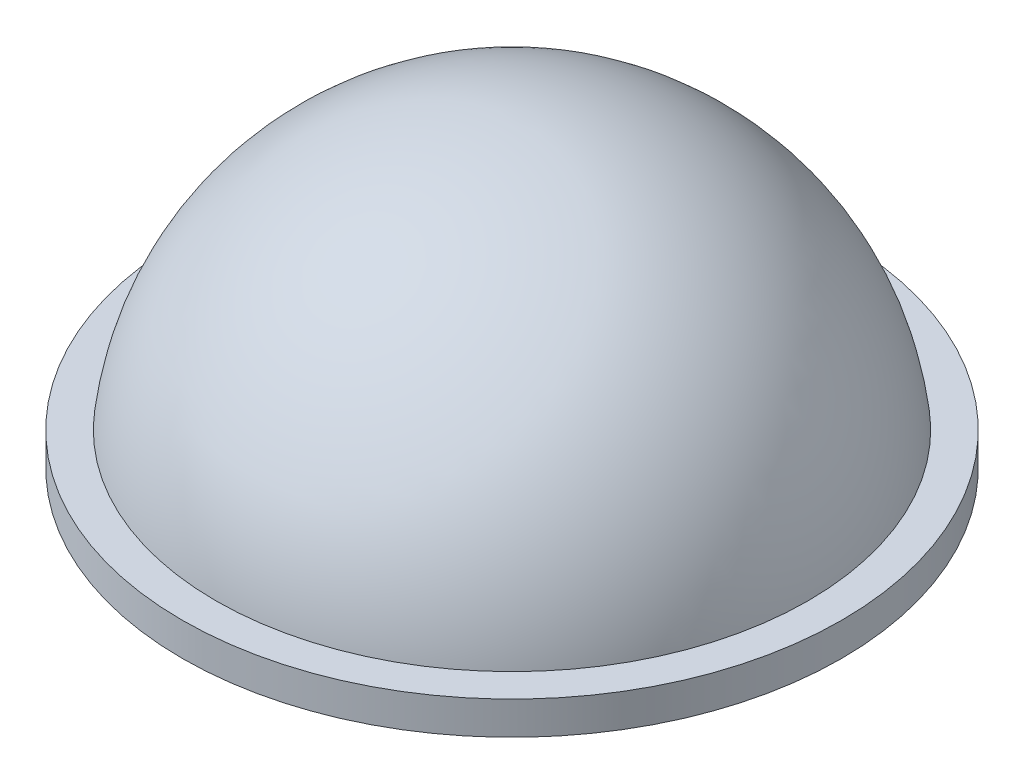
ISO-10303-21;
HEADER;
FILE_DESCRIPTION(('STEP AP214'),'2;1');
FILE_NAME('part.step','',(''),(''),'','','');
FILE_SCHEMA(('AUTOMOTIVE_DESIGN { 1 0 10303 214 1 1 1 1 }'));
ENDSEC;
DATA;
#1=APPLICATION_CONTEXT('core data for automotive mechanical design processes');
#2=APPLICATION_PROTOCOL_DEFINITION('international standard','automotive_design',2000,#1);
#3=PRODUCT_CONTEXT('',#1,'mechanical');
#4=PRODUCT('Part','Part','',(#3));
#5=PRODUCT_RELATED_PRODUCT_CATEGORY('part','',(#4));
#6=PRODUCT_DEFINITION_FORMATION('','',#4);
#7=PRODUCT_DEFINITION_CONTEXT('part definition',#1,'design');
#8=PRODUCT_DEFINITION('design','',#6,#7);
#9=PRODUCT_DEFINITION_SHAPE('','',#8);
#10=(LENGTH_UNIT() NAMED_UNIT(*) SI_UNIT(.MILLI.,.METRE.));
#11=(NAMED_UNIT(*) PLANE_ANGLE_UNIT() SI_UNIT($,.RADIAN.));
#12=(NAMED_UNIT(*) SI_UNIT($,.STERADIAN.) SOLID_ANGLE_UNIT());
#13=UNCERTAINTY_MEASURE_WITH_UNIT(LENGTH_MEASURE(1.E-05),#10,'distance_accuracy_value','');
#14=(GEOMETRIC_REPRESENTATION_CONTEXT(3) GLOBAL_UNCERTAINTY_ASSIGNED_CONTEXT((#13)) GLOBAL_UNIT_ASSIGNED_CONTEXT((#10,
#11,#12)) REPRESENTATION_CONTEXT('',''));
#15=CARTESIAN_POINT('',(0.,0.,0.));
#16=DIRECTION('',(0.,0.,1.));
#17=DIRECTION('',(1.,0.,0.));
#18=AXIS2_PLACEMENT_3D('',#15,#16,#17);
#19=CARTESIAN_POINT('',(0.,0.,0.));
#20=DIRECTION('',(0.,1.,0.));
#21=DIRECTION('',(1.,0.,0.));
#22=AXIS2_PLACEMENT_3D('',#19,#20,#21);
#23=SPHERICAL_SURFACE('',#22,45.);
#24=CARTESIAN_POINT('',(0.,5.,0.));
#25=DIRECTION('',(0.,1.,0.));
#26=DIRECTION('',(0.,0.,1.));
#27=AXIS2_PLACEMENT_3D('',#24,#25,#26);
#28=CIRCLE('',#27,44.7213595499958);
#29=CARTESIAN_POINT('',(0.,5.,44.7213595499958));
#30=VERTEX_POINT('',#29);
#31=EDGE_CURVE('E10',#30,#30,#28,.T.);
#32=ORIENTED_EDGE('',*,*,#31,.T.);
#33=EDGE_LOOP('',(#32));
#34=FACE_BOUND('',#33,.T.);
#35=ADVANCED_FACE('F32',(#34),#23,.T.);
#36=CARTESIAN_POINT('',(-44.7213595499958,4.99999999999999,0.));
#37=DIRECTION('',(0.,1.,0.));
#38=DIRECTION('',(0.,0.,1.));
#39=AXIS2_PLACEMENT_3D('',#36,#37,#38);
#40=PLANE('',#39);
#41=CARTESIAN_POINT('',(0.,5.,0.));
#42=DIRECTION('',(0.,1.,0.));
#43=DIRECTION('',(0.,0.,1.));
#44=AXIS2_PLACEMENT_3D('',#41,#42,#43);
#45=CIRCLE('',#44,49.8);
#46=CARTESIAN_POINT('',(0.,5.,49.8));
#47=VERTEX_POINT('',#46);
#48=EDGE_CURVE('E38',#47,#47,#45,.T.);
#49=ORIENTED_EDGE('',*,*,#48,.T.);
#50=EDGE_LOOP('',(#49));
#51=FACE_BOUND('',#50,.T.);
#52=ORIENTED_EDGE('',*,*,#31,.F.);
#53=EDGE_LOOP('',(#52));
#54=FACE_BOUND('',#53,.T.);
#55=ADVANCED_FACE('F64',(#51,#54),#40,.T.);
#56=CARTESIAN_POINT('',(0.,45.,0.));
#57=DIRECTION('',(0.,1.,0.));
#58=DIRECTION('',(0.,0.,1.));
#59=AXIS2_PLACEMENT_3D('',#56,#57,#58);
#60=CYLINDRICAL_SURFACE('',#59,49.8);
#61=CARTESIAN_POINT('',(0.,0.,0.));
#62=DIRECTION('',(0.,1.,0.));
#63=DIRECTION('',(0.,0.,1.));
#64=AXIS2_PLACEMENT_3D('',#61,#62,#63);
#65=CIRCLE('',#64,49.8);
#66=CARTESIAN_POINT('',(0.,0.,49.8));
#67=VERTEX_POINT('',#66);
#68=EDGE_CURVE('E42',#67,#67,#65,.T.);
#69=ORIENTED_EDGE('',*,*,#68,.T.);
#70=EDGE_LOOP('',(#69));
#71=FACE_BOUND('',#70,.T.);
#72=ORIENTED_EDGE('',*,*,#48,.F.);
#73=EDGE_LOOP('',(#72));
#74=FACE_BOUND('',#73,.T.);
#75=ADVANCED_FACE('F61',(#71,#74),#60,.T.);
#76=CARTESIAN_POINT('',(-49.8,0.,0.));
#77=DIRECTION('',(0.,-1.,0.));
#78=DIRECTION('',(0.,0.,-1.));
#79=AXIS2_PLACEMENT_3D('',#76,#77,#78);
#80=PLANE('',#79);
#81=CARTESIAN_POINT('',(0.,0.,0.));
#82=DIRECTION('',(0.,1.,0.));
#83=DIRECTION('',(0.,0.,1.));
#84=AXIS2_PLACEMENT_3D('',#81,#82,#83);
#85=CIRCLE('',#84,40.);
#86=CARTESIAN_POINT('',(0.,0.,40.));
#87=VERTEX_POINT('',#86);
#88=EDGE_CURVE('E46',#87,#87,#85,.T.);
#89=ORIENTED_EDGE('',*,*,#88,.T.);
#90=EDGE_LOOP('',(#89));
#91=FACE_BOUND('',#90,.T.);
#92=ORIENTED_EDGE('',*,*,#68,.F.);
#93=EDGE_LOOP('',(#92));
#94=FACE_BOUND('',#93,.T.);
#95=ADVANCED_FACE('F52',(#91,#94),#80,.T.);
#96=CARTESIAN_POINT('',(0.,0.,0.));
#97=DIRECTION('',(0.,1.,0.));
#98=DIRECTION('',(1.,0.,0.));
#99=AXIS2_PLACEMENT_3D('',#96,#97,#98);
#100=SPHERICAL_SURFACE('',#99,40.);
#101=ORIENTED_EDGE('',*,*,#88,.F.);
#102=EDGE_LOOP('',(#101));
#103=FACE_BOUND('',#102,.T.);
#104=ADVANCED_FACE('F55',(#103),#100,.F.);
#105=CLOSED_SHELL('',(#35,#55,#75,#95,#104));
#106=MANIFOLD_SOLID_BREP('B2',#105);
#107=ADVANCED_BREP_SHAPE_REPRESENTATION('',(#18,#106),#14);
#108=SHAPE_DEFINITION_REPRESENTATION(#9,#107);
ENDSEC;
END-ISO-10303-21;
